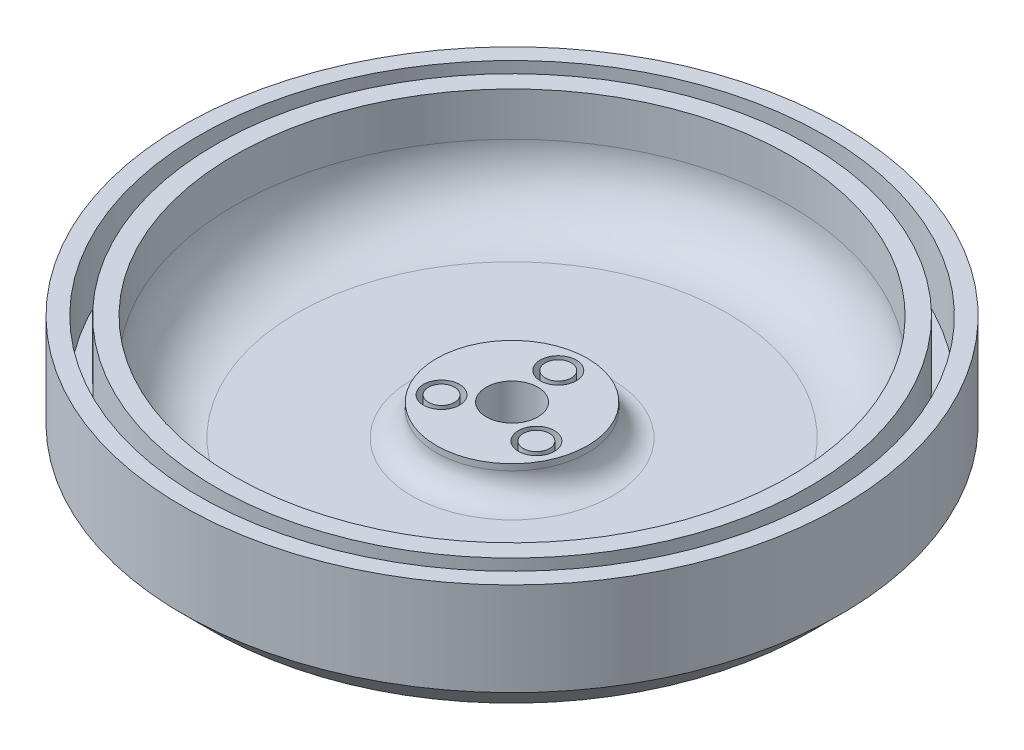
ISO-10303-21;
HEADER;
FILE_DESCRIPTION(('STEP AP214'),'2;1');
FILE_NAME('part.step','',(''),(''),'','','');
FILE_SCHEMA(('AUTOMOTIVE_DESIGN { 1 0 10303 214 1 1 1 1 }'));
ENDSEC;
DATA;
#1=APPLICATION_CONTEXT('core data for automotive mechanical design processes');
#2=APPLICATION_PROTOCOL_DEFINITION('international standard','automotive_design',2000,#1);
#3=PRODUCT_CONTEXT('',#1,'mechanical');
#4=PRODUCT('Part','Part','',(#3));
#5=PRODUCT_RELATED_PRODUCT_CATEGORY('part','',(#4));
#6=PRODUCT_DEFINITION_FORMATION('','',#4);
#7=PRODUCT_DEFINITION_CONTEXT('part definition',#1,'design');
#8=PRODUCT_DEFINITION('design','',#6,#7);
#9=PRODUCT_DEFINITION_SHAPE('','',#8);
#10=(LENGTH_UNIT() NAMED_UNIT(*) SI_UNIT(.MILLI.,.METRE.));
#11=(NAMED_UNIT(*) PLANE_ANGLE_UNIT() SI_UNIT($,.RADIAN.));
#12=(NAMED_UNIT(*) SI_UNIT($,.STERADIAN.) SOLID_ANGLE_UNIT());
#13=UNCERTAINTY_MEASURE_WITH_UNIT(LENGTH_MEASURE(1.E-05),#10,'distance_accuracy_value','');
#14=(GEOMETRIC_REPRESENTATION_CONTEXT(3) GLOBAL_UNCERTAINTY_ASSIGNED_CONTEXT((#13)) GLOBAL_UNIT_ASSIGNED_CONTEXT((#10,
#11,#12)) REPRESENTATION_CONTEXT('',''));
#15=CARTESIAN_POINT('',(0.,0.,0.));
#16=DIRECTION('',(0.,0.,1.));
#17=DIRECTION('',(1.,0.,0.));
#18=AXIS2_PLACEMENT_3D('',#15,#16,#17);
#19=CARTESIAN_POINT('',(-50.3,10.,0.));
#20=DIRECTION('',(0.,-1.,0.));
#21=DIRECTION('',(0.,0.,-1.));
#22=AXIS2_PLACEMENT_3D('',#19,#20,#21);
#23=PLANE('',#22);
#24=CARTESIAN_POINT('',(0.,10.,0.));
#25=DIRECTION('',(0.,-1.,0.));
#26=DIRECTION('',(0.,0.,-1.));
#27=AXIS2_PLACEMENT_3D('',#24,#25,#26);
#28=CIRCLE('',#27,53.);
#29=CARTESIAN_POINT('',(0.,10.,-53.));
#30=VERTEX_POINT('',#29);
#31=EDGE_CURVE('E107',#30,#30,#28,.T.);
#32=ORIENTED_EDGE('',*,*,#31,.F.);
#33=EDGE_LOOP('',(#32));
#34=FACE_BOUND('',#33,.T.);
#35=CARTESIAN_POINT('',(0.,10.,0.));
#36=DIRECTION('',(0.,-1.,0.));
#37=DIRECTION('',(0.,0.,-1.));
#38=AXIS2_PLACEMENT_3D('',#35,#36,#37);
#39=CIRCLE('',#38,50.3);
#40=CARTESIAN_POINT('',(0.,10.,-50.3));
#41=VERTEX_POINT('',#40);
#42=EDGE_CURVE('E77',#41,#41,#39,.T.);
#43=ORIENTED_EDGE('',*,*,#42,.T.);
#44=EDGE_LOOP('',(#43));
#45=FACE_BOUND('',#44,.T.);
#46=ADVANCED_FACE('F54',(#34,#45),#23,.F.);
#47=CARTESIAN_POINT('',(0.,0.,0.));
#48=DIRECTION('',(0.,-1.,0.));
#49=DIRECTION('',(0.,0.,-1.));
#50=AXIS2_PLACEMENT_3D('',#47,#48,#49);
#51=CYLINDRICAL_SURFACE('',#50,50.3);
#52=ORIENTED_EDGE('',*,*,#42,.F.);
#53=EDGE_LOOP('',(#52));
#54=FACE_BOUND('',#53,.T.);
#55=CARTESIAN_POINT('',(0.,-0.3,0.));
#56=DIRECTION('',(0.,-1.,0.));
#57=DIRECTION('',(0.,0.,-1.));
#58=AXIS2_PLACEMENT_3D('',#55,#56,#57);
#59=CIRCLE('',#58,50.3);
#60=CARTESIAN_POINT('',(0.,-0.3,-50.3));
#61=VERTEX_POINT('',#60);
#62=EDGE_CURVE('E80',#61,#61,#59,.T.);
#63=ORIENTED_EDGE('',*,*,#62,.T.);
#64=EDGE_LOOP('',(#63));
#65=FACE_BOUND('',#64,.T.);
#66=ADVANCED_FACE('F178',(#54,#65),#51,.F.);
#67=CARTESIAN_POINT('',(-50.3,-0.299999999999997,0.));
#68=DIRECTION('',(0.,-1.,0.));
#69=DIRECTION('',(0.,0.,-1.));
#70=AXIS2_PLACEMENT_3D('',#67,#68,#69);
#71=PLANE('',#70);
#72=ORIENTED_EDGE('',*,*,#62,.F.);
#73=EDGE_LOOP('',(#72));
#74=FACE_BOUND('',#73,.T.);
#75=CARTESIAN_POINT('',(0.,-0.299999999999995,0.));
#76=DIRECTION('',(0.,-1.,0.));
#77=DIRECTION('',(0.,0.,-1.));
#78=AXIS2_PLACEMENT_3D('',#75,#76,#77);
#79=CIRCLE('',#78,47.7);
#80=CARTESIAN_POINT('',(0.,-0.299999999999995,-47.7));
#81=VERTEX_POINT('',#80);
#82=EDGE_CURVE('E83',#81,#81,#79,.T.);
#83=ORIENTED_EDGE('',*,*,#82,.T.);
#84=EDGE_LOOP('',(#83));
#85=FACE_BOUND('',#84,.T.);
#86=ADVANCED_FACE('F183',(#74,#85),#71,.F.);
#87=CARTESIAN_POINT('',(0.,0.,0.));
#88=DIRECTION('',(0.,-1.,0.));
#89=DIRECTION('',(0.,0.,-1.));
#90=AXIS2_PLACEMENT_3D('',#87,#88,#89);
#91=CYLINDRICAL_SURFACE('',#90,47.7);
#92=ORIENTED_EDGE('',*,*,#82,.F.);
#93=EDGE_LOOP('',(#92));
#94=FACE_BOUND('',#93,.T.);
#95=CARTESIAN_POINT('',(0.,10.,0.));
#96=DIRECTION('',(0.,-1.,0.));
#97=DIRECTION('',(0.,0.,-1.));
#98=AXIS2_PLACEMENT_3D('',#95,#96,#97);
#99=CIRCLE('',#98,47.7);
#100=CARTESIAN_POINT('',(0.,10.,-47.7));
#101=VERTEX_POINT('',#100);
#102=EDGE_CURVE('E86',#101,#101,#99,.T.);
#103=ORIENTED_EDGE('',*,*,#102,.T.);
#104=EDGE_LOOP('',(#103));
#105=FACE_BOUND('',#104,.T.);
#106=ADVANCED_FACE('F191',(#94,#105),#91,.T.);
#107=CARTESIAN_POINT('',(-44.7,10.,0.));
#108=DIRECTION('',(0.,-1.,0.));
#109=DIRECTION('',(0.,0.,-1.));
#110=AXIS2_PLACEMENT_3D('',#107,#108,#109);
#111=PLANE('',#110);
#112=ORIENTED_EDGE('',*,*,#102,.F.);
#113=EDGE_LOOP('',(#112));
#114=FACE_BOUND('',#113,.T.);
#115=CARTESIAN_POINT('',(0.,10.,0.));
#116=DIRECTION('',(0.,-1.,0.));
#117=DIRECTION('',(0.,0.,-1.));
#118=AXIS2_PLACEMENT_3D('',#115,#116,#117);
#119=CIRCLE('',#118,44.7);
#120=CARTESIAN_POINT('',(0.,10.,-44.7));
#121=VERTEX_POINT('',#120);
#122=EDGE_CURVE('E89',#121,#121,#119,.T.);
#123=ORIENTED_EDGE('',*,*,#122,.T.);
#124=EDGE_LOOP('',(#123));
#125=FACE_BOUND('',#124,.T.);
#126=ADVANCED_FACE('F195',(#114,#125),#111,.F.);
#127=CARTESIAN_POINT('',(0.,0.,0.));
#128=DIRECTION('',(0.,-1.,0.));
#129=DIRECTION('',(0.,0.,-1.));
#130=AXIS2_PLACEMENT_3D('',#127,#128,#129);
#131=CYLINDRICAL_SURFACE('',#130,44.7);
#132=ORIENTED_EDGE('',*,*,#122,.F.);
#133=EDGE_LOOP('',(#132));
#134=FACE_BOUND('',#133,.T.);
#135=CARTESIAN_POINT('',(0.,3.,0.));
#136=DIRECTION('',(0.,-1.,0.));
#137=DIRECTION('',(0.,0.,-1.));
#138=AXIS2_PLACEMENT_3D('',#135,#136,#137);
#139=CIRCLE('',#138,44.7);
#140=CARTESIAN_POINT('',(0.,3.,-44.7));
#141=VERTEX_POINT('',#140);
#142=EDGE_CURVE('E92',#141,#141,#139,.T.);
#143=ORIENTED_EDGE('',*,*,#142,.T.);
#144=EDGE_LOOP('',(#143));
#145=FACE_BOUND('',#144,.T.);
#146=ADVANCED_FACE('F199',(#134,#145),#131,.F.);
#147=CARTESIAN_POINT('',(0.,3.,0.));
#148=DIRECTION('',(0.,-1.,0.));
#149=DIRECTION('',(0.,0.,-1.));
#150=AXIS2_PLACEMENT_3D('',#147,#148,#149);
#151=TOROIDAL_SURFACE('',#150,34.7,10.);
#152=ORIENTED_EDGE('',*,*,#142,.F.);
#153=EDGE_LOOP('',(#152));
#154=FACE_BOUND('',#153,.T.);
#155=CARTESIAN_POINT('',(0.,-7.,0.));
#156=DIRECTION('',(0.,-1.,0.));
#157=DIRECTION('',(0.,0.,-1.));
#158=AXIS2_PLACEMENT_3D('',#155,#156,#157);
#159=CIRCLE('',#158,34.7);
#160=CARTESIAN_POINT('',(0.,-7.,-34.7));
#161=VERTEX_POINT('',#160);
#162=EDGE_CURVE('E95',#161,#161,#159,.T.);
#163=ORIENTED_EDGE('',*,*,#162,.T.);
#164=EDGE_LOOP('',(#163));
#165=FACE_BOUND('',#164,.T.);
#166=ADVANCED_FACE('F203',(#154,#165),#151,.F.);
#167=CARTESIAN_POINT('',(-17.1500000000001,-7.,0.));
#168=DIRECTION('',(0.,-1.,0.));
#169=DIRECTION('',(0.,0.,-1.));
#170=AXIS2_PLACEMENT_3D('',#167,#168,#169);
#171=PLANE('',#170);
#172=CARTESIAN_POINT('',(-1.00058850094342E-13,-7.,3.06088487889156E-13));
#173=DIRECTION('',(0.,-1.,0.));
#174=DIRECTION('',(0.,0.,-1.));
#175=AXIS2_PLACEMENT_3D('',#172,#173,#174);
#176=CIRCLE('',#175,16.15);
#177=CARTESIAN_POINT('',(-1.00058850094342E-13,-7.,-16.1499999999997));
#178=VERTEX_POINT('',#177);
#179=EDGE_CURVE('E11',#178,#178,#176,.T.);
#180=ORIENTED_EDGE('',*,*,#179,.T.);
#181=EDGE_LOOP('',(#180));
#182=FACE_BOUND('',#181,.T.);
#183=ORIENTED_EDGE('',*,*,#162,.F.);
#184=EDGE_LOOP('',(#183));
#185=FACE_BOUND('',#184,.T.);
#186=ADVANCED_FACE('F206',(#182,#185),#171,.F.);
#187=CARTESIAN_POINT('',(0.,0.,0.));
#188=DIRECTION('',(0.,-1.,0.));
#189=DIRECTION('',(0.,0.,-1.));
#190=AXIS2_PLACEMENT_3D('',#187,#188,#189);
#191=CYLINDRICAL_SURFACE('',#190,4.15);
#192=CARTESIAN_POINT('',(0.,-10.,0.));
#193=DIRECTION('',(0.,-1.,0.));
#194=DIRECTION('',(0.,0.,-1.));
#195=AXIS2_PLACEMENT_3D('',#192,#193,#194);
#196=CIRCLE('',#195,4.15);
#197=CARTESIAN_POINT('',(0.,-10.,-4.15));
#198=VERTEX_POINT('',#197);
#199=EDGE_CURVE('E98',#198,#198,#196,.T.);
#200=ORIENTED_EDGE('',*,*,#199,.T.);
#201=EDGE_LOOP('',(#200));
#202=FACE_BOUND('',#201,.T.);
#203=CARTESIAN_POINT('',(0.,-2.,0.));
#204=DIRECTION('',(0.,1.,0.));
#205=DIRECTION('',(0.,0.,1.));
#206=AXIS2_PLACEMENT_3D('',#203,#204,#205);
#207=CIRCLE('',#206,4.15);
#208=CARTESIAN_POINT('',(0.,-2.,4.15));
#209=VERTEX_POINT('',#208);
#210=EDGE_CURVE('E124',#209,#209,#207,.F.);
#211=ORIENTED_EDGE('',*,*,#210,.F.);
#212=EDGE_LOOP('',(#211));
#213=FACE_BOUND('',#212,.T.);
#214=ADVANCED_FACE('F210',(#202,#213),#191,.F.);
#215=CARTESIAN_POINT('',(-48.,-10.,0.));
#216=DIRECTION('',(0.,1.,0.));
#217=DIRECTION('',(0.,0.,1.));
#218=AXIS2_PLACEMENT_3D('',#215,#216,#217);
#219=PLANE('',#218);
#220=ORIENTED_EDGE('',*,*,#199,.F.);
#221=EDGE_LOOP('',(#220));
#222=FACE_BOUND('',#221,.T.);
#223=CARTESIAN_POINT('',(0.,-10.,0.));
#224=DIRECTION('',(0.,-1.,0.));
#225=DIRECTION('',(0.,0.,-1.));
#226=AXIS2_PLACEMENT_3D('',#223,#224,#225);
#227=CIRCLE('',#226,48.);
#228=CARTESIAN_POINT('',(0.,-10.,-48.));
#229=VERTEX_POINT('',#228);
#230=EDGE_CURVE('E101',#229,#229,#227,.T.);
#231=ORIENTED_EDGE('',*,*,#230,.T.);
#232=EDGE_LOOP('',(#231));
#233=FACE_BOUND('',#232,.T.);
#234=ADVANCED_FACE('F213',(#222,#233),#219,.F.);
#235=CARTESIAN_POINT('',(0.,-4.99999999999999,0.));
#236=DIRECTION('',(0.,1.,0.));
#237=DIRECTION('',(0.,0.,1.));
#238=AXIS2_PLACEMENT_3D('',#235,#236,#237);
#239=CONICAL_SURFACE('',#238,53.,0.785398163397447);
#240=ORIENTED_EDGE('',*,*,#230,.F.);
#241=EDGE_LOOP('',(#240));
#242=FACE_BOUND('',#241,.T.);
#243=CARTESIAN_POINT('',(0.,-4.99999999999999,0.));
#244=DIRECTION('',(0.,-1.,0.));
#245=DIRECTION('',(0.,0.,-1.));
#246=AXIS2_PLACEMENT_3D('',#243,#244,#245);
#247=CIRCLE('',#246,53.);
#248=CARTESIAN_POINT('',(0.,-4.99999999999999,-53.));
#249=VERTEX_POINT('',#248);
#250=EDGE_CURVE('E104',#249,#249,#247,.T.);
#251=ORIENTED_EDGE('',*,*,#250,.T.);
#252=EDGE_LOOP('',(#251));
#253=FACE_BOUND('',#252,.T.);
#254=ADVANCED_FACE('F217',(#242,#253),#239,.T.);
#255=CARTESIAN_POINT('',(0.,0.,0.));
#256=DIRECTION('',(0.,-1.,0.));
#257=DIRECTION('',(0.,0.,-1.));
#258=AXIS2_PLACEMENT_3D('',#255,#256,#257);
#259=CYLINDRICAL_SURFACE('',#258,53.);
#260=ORIENTED_EDGE('',*,*,#250,.F.);
#261=EDGE_LOOP('',(#260));
#262=FACE_BOUND('',#261,.T.);
#263=ORIENTED_EDGE('',*,*,#31,.T.);
#264=EDGE_LOOP('',(#263));
#265=FACE_BOUND('',#264,.T.);
#266=ADVANCED_FACE('F174',(#262,#265),#259,.T.);
#267=CARTESIAN_POINT('',(-6.68777171426959,-2.,4.65791900936672));
#268=DIRECTION('',(0.,-1.,0.));
#269=DIRECTION('',(0.,0.,-1.));
#270=AXIS2_PLACEMENT_3D('',#267,#268,#269);
#271=CYLINDRICAL_SURFACE('',#270,2.9);
#272=CARTESIAN_POINT('',(-6.68777171426959,-2.,4.65791900936672));
#273=DIRECTION('',(0.,1.,0.));
#274=DIRECTION('',(0.,0.,1.));
#275=AXIS2_PLACEMENT_3D('',#272,#273,#274);
#276=CIRCLE('',#275,2.9);
#277=CARTESIAN_POINT('',(-6.68777171426959,-2.,7.55791900936672));
#278=VERTEX_POINT('',#277);
#279=EDGE_CURVE('E127',#278,#278,#276,.T.);
#280=ORIENTED_EDGE('',*,*,#279,.T.);
#281=EDGE_LOOP('',(#280));
#282=FACE_BOUND('',#281,.T.);
#283=CARTESIAN_POINT('',(-6.68777171426959,-7.,4.65791900936672));
#284=DIRECTION('',(0.,1.,0.));
#285=DIRECTION('',(0.,0.,1.));
#286=AXIS2_PLACEMENT_3D('',#283,#284,#285);
#287=CIRCLE('',#286,2.9);
#288=CARTESIAN_POINT('',(-6.68777171426959,-7.,7.55791900936672));
#289=VERTEX_POINT('',#288);
#290=EDGE_CURVE('E111',#289,#289,#287,.T.);
#291=ORIENTED_EDGE('',*,*,#290,.F.);
#292=EDGE_LOOP('',(#291));
#293=FACE_BOUND('',#292,.T.);
#294=ADVANCED_FACE('F164',(#282,#293),#271,.F.);
#295=CARTESIAN_POINT('',(-0.689990333747191,-2.,-8.12073970395183));
#296=DIRECTION('',(0.,-1.,0.));
#297=DIRECTION('',(0.,0.,-1.));
#298=AXIS2_PLACEMENT_3D('',#295,#296,#297);
#299=CYLINDRICAL_SURFACE('',#298,2.9);
#300=CARTESIAN_POINT('',(-0.689990333747191,-2.,-8.12073970395183));
#301=DIRECTION('',(0.,1.,0.));
#302=DIRECTION('',(0.,0.,1.));
#303=AXIS2_PLACEMENT_3D('',#300,#301,#302);
#304=CIRCLE('',#303,2.9);
#305=CARTESIAN_POINT('',(-0.689990333747191,-2.,-5.22073970395183));
#306=VERTEX_POINT('',#305);
#307=EDGE_CURVE('E130',#306,#306,#304,.T.);
#308=ORIENTED_EDGE('',*,*,#307,.T.);
#309=EDGE_LOOP('',(#308));
#310=FACE_BOUND('',#309,.T.);
#311=CARTESIAN_POINT('',(-0.689990333747191,-7.,-8.12073970395183));
#312=DIRECTION('',(0.,1.,0.));
#313=DIRECTION('',(0.,0.,1.));
#314=AXIS2_PLACEMENT_3D('',#311,#312,#313);
#315=CIRCLE('',#314,2.9);
#316=CARTESIAN_POINT('',(-0.689990333747191,-7.,-5.22073970395183));
#317=VERTEX_POINT('',#316);
#318=EDGE_CURVE('E115',#317,#317,#315,.T.);
#319=ORIENTED_EDGE('',*,*,#318,.F.);
#320=EDGE_LOOP('',(#319));
#321=FACE_BOUND('',#320,.T.);
#322=ADVANCED_FACE('F161',(#310,#321),#299,.F.);
#323=CARTESIAN_POINT('',(7.37776204801678,-2.,3.46282069458518));
#324=DIRECTION('',(0.,-1.,0.));
#325=DIRECTION('',(0.,0.,-1.));
#326=AXIS2_PLACEMENT_3D('',#323,#324,#325);
#327=CYLINDRICAL_SURFACE('',#326,2.9);
#328=CARTESIAN_POINT('',(7.37776204801678,-2.,3.46282069458518));
#329=DIRECTION('',(0.,1.,0.));
#330=DIRECTION('',(0.,0.,1.));
#331=AXIS2_PLACEMENT_3D('',#328,#329,#330);
#332=CIRCLE('',#331,2.9);
#333=CARTESIAN_POINT('',(7.37776204801678,-2.,6.36282069458518));
#334=VERTEX_POINT('',#333);
#335=EDGE_CURVE('E114',#334,#334,#332,.T.);
#336=ORIENTED_EDGE('',*,*,#335,.T.);
#337=EDGE_LOOP('',(#336));
#338=FACE_BOUND('',#337,.T.);
#339=CARTESIAN_POINT('',(7.37776204801678,-7.,3.46282069458518));
#340=DIRECTION('',(0.,1.,0.));
#341=DIRECTION('',(0.,0.,1.));
#342=AXIS2_PLACEMENT_3D('',#339,#340,#341);
#343=CIRCLE('',#342,2.9);
#344=CARTESIAN_POINT('',(7.37776204801678,-7.,6.36282069458518));
#345=VERTEX_POINT('',#344);
#346=EDGE_CURVE('E118',#345,#345,#343,.T.);
#347=ORIENTED_EDGE('',*,*,#346,.F.);
#348=EDGE_LOOP('',(#347));
#349=FACE_BOUND('',#348,.T.);
#350=ADVANCED_FACE('F163',(#338,#349),#327,.F.);
#351=CARTESIAN_POINT('',(-1.00058850094342E-13,-2.,3.06088487889156E-13));
#352=DIRECTION('',(0.,-1.,0.));
#353=DIRECTION('',(0.,0.,-1.));
#354=AXIS2_PLACEMENT_3D('',#351,#352,#353);
#355=CYLINDRICAL_SURFACE('',#354,12.15);
#356=CARTESIAN_POINT('',(-1.00058850094342E-13,-3.,3.06088487889156E-13));
#357=DIRECTION('',(0.,-1.,0.));
#358=DIRECTION('',(0.,0.,-1.));
#359=AXIS2_PLACEMENT_3D('',#356,#357,#358);
#360=CIRCLE('',#359,12.15);
#361=CARTESIAN_POINT('',(-1.00058850094342E-13,-3.,-12.1499999999997));
#362=VERTEX_POINT('',#361);
#363=EDGE_CURVE('E61',#362,#362,#360,.F.);
#364=ORIENTED_EDGE('',*,*,#363,.T.);
#365=EDGE_LOOP('',(#364));
#366=FACE_BOUND('',#365,.T.);
#367=CARTESIAN_POINT('',(-1.00058850094342E-13,-2.,3.06088487889156E-13));
#368=DIRECTION('',(0.,1.,0.));
#369=DIRECTION('',(0.,0.,1.));
#370=AXIS2_PLACEMENT_3D('',#367,#368,#369);
#371=CIRCLE('',#370,12.15);
#372=CARTESIAN_POINT('',(-1.00058850094342E-13,-2.,12.1500000000003));
#373=VERTEX_POINT('',#372);
#374=EDGE_CURVE('E110',#373,#373,#371,.T.);
#375=ORIENTED_EDGE('',*,*,#374,.F.);
#376=EDGE_LOOP('',(#375));
#377=FACE_BOUND('',#376,.T.);
#378=ADVANCED_FACE('F171',(#366,#377),#355,.T.);
#379=CARTESIAN_POINT('',(0.,-2.,0.));
#380=DIRECTION('',(0.,1.,0.));
#381=DIRECTION('',(0.,0.,1.));
#382=AXIS2_PLACEMENT_3D('',#379,#380,#381);
#383=PLANE('',#382);
#384=ORIENTED_EDGE('',*,*,#335,.F.);
#385=EDGE_LOOP('',(#384));
#386=FACE_BOUND('',#385,.T.);
#387=ORIENTED_EDGE('',*,*,#307,.F.);
#388=EDGE_LOOP('',(#387));
#389=FACE_BOUND('',#388,.T.);
#390=ORIENTED_EDGE('',*,*,#279,.F.);
#391=EDGE_LOOP('',(#390));
#392=FACE_BOUND('',#391,.T.);
#393=ORIENTED_EDGE('',*,*,#210,.T.);
#394=EDGE_LOOP('',(#393));
#395=FACE_BOUND('',#394,.T.);
#396=ORIENTED_EDGE('',*,*,#374,.T.);
#397=EDGE_LOOP('',(#396));
#398=FACE_BOUND('',#397,.T.);
#399=ADVANCED_FACE('F258',(#386,#389,#392,#395,#398),#383,.T.);
#400=CARTESIAN_POINT('',(7.37776204801678,-7.,3.46282069458518));
#401=DIRECTION('',(0.,-1.,0.));
#402=DIRECTION('',(0.,0.,-1.));
#403=AXIS2_PLACEMENT_3D('',#400,#401,#402);
#404=CIRCLE('',#403,2.1);
#405=CARTESIAN_POINT('',(7.37776204801678,-7.,1.36282069458517));
#406=VERTEX_POINT('',#405);
#407=EDGE_CURVE('E69',#406,#406,#404,.F.);
#408=ORIENTED_EDGE('',*,*,#407,.F.);
#409=EDGE_LOOP('',(#408));
#410=FACE_BOUND('',#409,.T.);
#411=ORIENTED_EDGE('',*,*,#346,.T.);
#412=EDGE_LOOP('',(#411));
#413=FACE_BOUND('',#412,.T.);
#414=ADVANCED_FACE('F157',(#410,#413),#171,.F.);
#415=CARTESIAN_POINT('',(-0.689990333747191,-7.,-8.12073970395183));
#416=DIRECTION('',(0.,-1.,0.));
#417=DIRECTION('',(0.,0.,-1.));
#418=AXIS2_PLACEMENT_3D('',#415,#416,#417);
#419=CIRCLE('',#418,2.1);
#420=CARTESIAN_POINT('',(-0.689990333747191,-7.,-10.2207397039518));
#421=VERTEX_POINT('',#420);
#422=EDGE_CURVE('E65',#421,#421,#419,.F.);
#423=ORIENTED_EDGE('',*,*,#422,.F.);
#424=EDGE_LOOP('',(#423));
#425=FACE_BOUND('',#424,.T.);
#426=ORIENTED_EDGE('',*,*,#318,.T.);
#427=EDGE_LOOP('',(#426));
#428=FACE_BOUND('',#427,.T.);
#429=ADVANCED_FACE('F153',(#425,#428),#171,.F.);
#430=CARTESIAN_POINT('',(-6.68777171426959,-7.,4.65791900936672));
#431=DIRECTION('',(0.,-1.,0.));
#432=DIRECTION('',(0.,0.,-1.));
#433=AXIS2_PLACEMENT_3D('',#430,#431,#432);
#434=CIRCLE('',#433,2.1);
#435=CARTESIAN_POINT('',(-6.68777171426959,-7.,2.55791900936671));
#436=VERTEX_POINT('',#435);
#437=EDGE_CURVE('E74',#436,#436,#434,.F.);
#438=ORIENTED_EDGE('',*,*,#437,.F.);
#439=EDGE_LOOP('',(#438));
#440=FACE_BOUND('',#439,.T.);
#441=ORIENTED_EDGE('',*,*,#290,.T.);
#442=EDGE_LOOP('',(#441));
#443=FACE_BOUND('',#442,.T.);
#444=ADVANCED_FACE('F156',(#440,#443),#171,.F.);
#445=CARTESIAN_POINT('',(-6.68777171426959,-2.,4.65791900936672));
#446=DIRECTION('',(0.,-1.,0.));
#447=DIRECTION('',(0.,0.,-1.));
#448=AXIS2_PLACEMENT_3D('',#445,#446,#447);
#449=CYLINDRICAL_SURFACE('',#448,2.1);
#450=CARTESIAN_POINT('',(-6.68777171426959,-2.,4.65791900936672));
#451=DIRECTION('',(0.,1.,0.));
#452=DIRECTION('',(0.,0.,1.));
#453=AXIS2_PLACEMENT_3D('',#450,#451,#452);
#454=CIRCLE('',#453,2.1);
#455=CARTESIAN_POINT('',(-6.68777171426959,-2.,6.75791900936672));
#456=VERTEX_POINT('',#455);
#457=EDGE_CURVE('E121',#456,#456,#454,.T.);
#458=ORIENTED_EDGE('',*,*,#457,.F.);
#459=EDGE_LOOP('',(#458));
#460=FACE_BOUND('',#459,.T.);
#461=ORIENTED_EDGE('',*,*,#437,.T.);
#462=EDGE_LOOP('',(#461));
#463=FACE_BOUND('',#462,.T.);
#464=ADVANCED_FACE('F291',(#460,#463),#449,.T.);
#465=CARTESIAN_POINT('',(0.,-2.,0.));
#466=DIRECTION('',(0.,1.,0.));
#467=DIRECTION('',(0.,0.,1.));
#468=AXIS2_PLACEMENT_3D('',#465,#466,#467);
#469=PLANE('',#468);
#470=ORIENTED_EDGE('',*,*,#457,.T.);
#471=EDGE_LOOP('',(#470));
#472=FACE_BOUND('',#471,.T.);
#473=ADVANCED_FACE('F300',(#472),#469,.T.);
#474=CARTESIAN_POINT('',(7.37776204801678,-2.,3.46282069458518));
#475=DIRECTION('',(0.,-1.,0.));
#476=DIRECTION('',(0.,0.,-1.));
#477=AXIS2_PLACEMENT_3D('',#474,#475,#476);
#478=CYLINDRICAL_SURFACE('',#477,2.1);
#479=CARTESIAN_POINT('',(7.37776204801678,-2.,3.46282069458518));
#480=DIRECTION('',(0.,1.,0.));
#481=DIRECTION('',(0.,0.,1.));
#482=AXIS2_PLACEMENT_3D('',#479,#480,#481);
#483=CIRCLE('',#482,2.1);
#484=CARTESIAN_POINT('',(7.37776204801678,-2.,5.56282069458518));
#485=VERTEX_POINT('',#484);
#486=EDGE_CURVE('E137',#485,#485,#483,.T.);
#487=ORIENTED_EDGE('',*,*,#486,.F.);
#488=EDGE_LOOP('',(#487));
#489=FACE_BOUND('',#488,.T.);
#490=ORIENTED_EDGE('',*,*,#407,.T.);
#491=EDGE_LOOP('',(#490));
#492=FACE_BOUND('',#491,.T.);
#493=ADVANCED_FACE('F311',(#489,#492),#478,.T.);
#494=CARTESIAN_POINT('',(0.,-2.,0.));
#495=DIRECTION('',(0.,1.,0.));
#496=DIRECTION('',(0.,0.,1.));
#497=AXIS2_PLACEMENT_3D('',#494,#495,#496);
#498=PLANE('',#497);
#499=ORIENTED_EDGE('',*,*,#486,.T.);
#500=EDGE_LOOP('',(#499));
#501=FACE_BOUND('',#500,.T.);
#502=ADVANCED_FACE('F149',(#501),#498,.T.);
#503=CARTESIAN_POINT('',(-0.689990333747191,-2.,-8.12073970395183));
#504=DIRECTION('',(0.,-1.,0.));
#505=DIRECTION('',(0.,0.,-1.));
#506=AXIS2_PLACEMENT_3D('',#503,#504,#505);
#507=CYLINDRICAL_SURFACE('',#506,2.1);
#508=CARTESIAN_POINT('',(-0.689990333747191,-2.,-8.12073970395183));
#509=DIRECTION('',(0.,1.,0.));
#510=DIRECTION('',(0.,0.,1.));
#511=AXIS2_PLACEMENT_3D('',#508,#509,#510);
#512=CIRCLE('',#511,2.1);
#513=CARTESIAN_POINT('',(-0.689990333747191,-2.,-6.02073970395182));
#514=VERTEX_POINT('',#513);
#515=EDGE_CURVE('E140',#514,#514,#512,.T.);
#516=ORIENTED_EDGE('',*,*,#515,.F.);
#517=EDGE_LOOP('',(#516));
#518=FACE_BOUND('',#517,.T.);
#519=ORIENTED_EDGE('',*,*,#422,.T.);
#520=EDGE_LOOP('',(#519));
#521=FACE_BOUND('',#520,.T.);
#522=ADVANCED_FACE('F146',(#518,#521),#507,.T.);
#523=CARTESIAN_POINT('',(0.,-2.,0.));
#524=DIRECTION('',(0.,1.,0.));
#525=DIRECTION('',(0.,0.,1.));
#526=AXIS2_PLACEMENT_3D('',#523,#524,#525);
#527=PLANE('',#526);
#528=ORIENTED_EDGE('',*,*,#515,.T.);
#529=EDGE_LOOP('',(#528));
#530=FACE_BOUND('',#529,.T.);
#531=ADVANCED_FACE('F144',(#530),#527,.T.);
#532=CARTESIAN_POINT('',(-1.00058850094342E-13,-3.,3.06088487889156E-13));
#533=DIRECTION('',(0.,-1.,0.));
#534=DIRECTION('',(0.,0.,-1.));
#535=AXIS2_PLACEMENT_3D('',#532,#533,#534);
#536=TOROIDAL_SURFACE('',#535,16.15,4.);
#537=ORIENTED_EDGE('',*,*,#179,.F.);
#538=EDGE_LOOP('',(#537));
#539=FACE_BOUND('',#538,.T.);
#540=ORIENTED_EDGE('',*,*,#363,.F.);
#541=EDGE_LOOP('',(#540));
#542=FACE_BOUND('',#541,.T.);
#543=ADVANCED_FACE('F56',(#539,#542),#536,.F.);
#544=CLOSED_SHELL('',(#46,#66,#86,#106,#126,#146,#166,#186,#214,#234,#254,#266,#294,#322,#350,
#378,#399,#414,#429,#444,#464,#473,#493,#502,#522,#531,#543));
#545=MANIFOLD_SOLID_BREP('B2',#544);
#546=ADVANCED_BREP_SHAPE_REPRESENTATION('',(#18,#545),#14);
#547=SHAPE_DEFINITION_REPRESENTATION(#9,#546);
ENDSEC;
END-ISO-10303-21;
